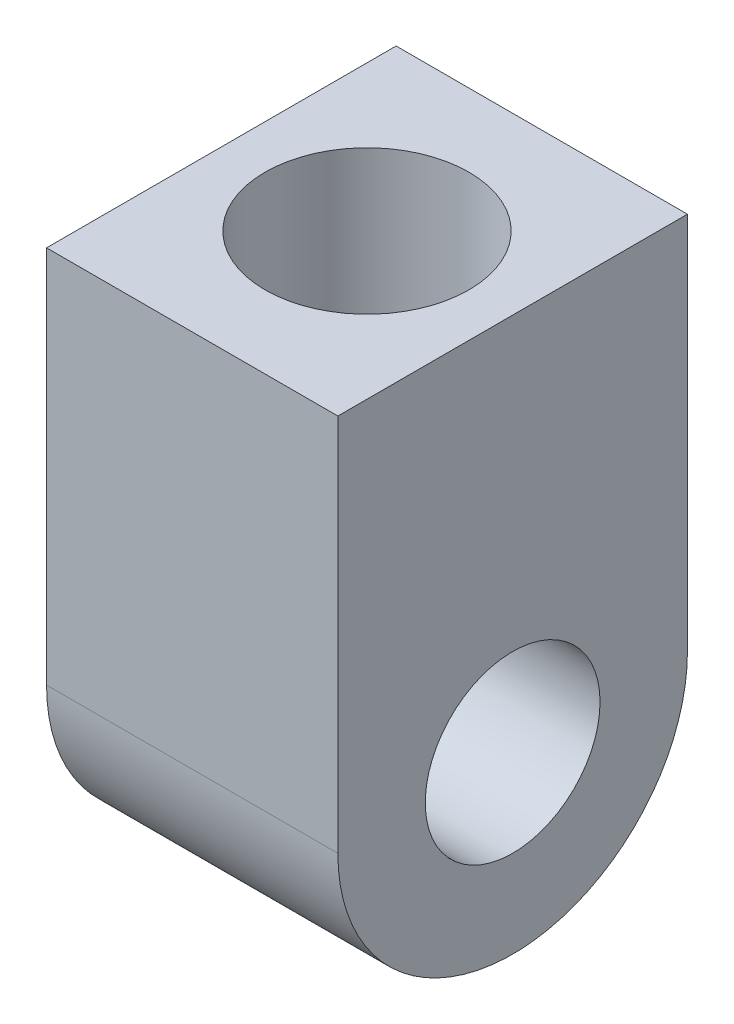
ISO-10303-21;
HEADER;
FILE_DESCRIPTION(('STEP AP214'),'2;1');
FILE_NAME('part.step','',(''),(''),'','','');
FILE_SCHEMA(('AUTOMOTIVE_DESIGN { 1 0 10303 214 1 1 1 1 }'));
ENDSEC;
DATA;
#1=APPLICATION_CONTEXT('core data for automotive mechanical design processes');
#2=APPLICATION_PROTOCOL_DEFINITION('international standard','automotive_design',2000,#1);
#3=PRODUCT_CONTEXT('',#1,'mechanical');
#4=PRODUCT('Part','Part','',(#3));
#5=PRODUCT_RELATED_PRODUCT_CATEGORY('part','',(#4));
#6=PRODUCT_DEFINITION_FORMATION('','',#4);
#7=PRODUCT_DEFINITION_CONTEXT('part definition',#1,'design');
#8=PRODUCT_DEFINITION('design','',#6,#7);
#9=PRODUCT_DEFINITION_SHAPE('','',#8);
#10=(LENGTH_UNIT() NAMED_UNIT(*) SI_UNIT(.MILLI.,.METRE.));
#11=(NAMED_UNIT(*) PLANE_ANGLE_UNIT() SI_UNIT($,.RADIAN.));
#12=(NAMED_UNIT(*) SI_UNIT($,.STERADIAN.) SOLID_ANGLE_UNIT());
#13=UNCERTAINTY_MEASURE_WITH_UNIT(LENGTH_MEASURE(1.E-05),#10,'distance_accuracy_value','');
#14=(GEOMETRIC_REPRESENTATION_CONTEXT(3) GLOBAL_UNCERTAINTY_ASSIGNED_CONTEXT((#13)) GLOBAL_UNIT_ASSIGNED_CONTEXT((#10,
#11,#12)) REPRESENTATION_CONTEXT('',''));
#15=CARTESIAN_POINT('',(0.,0.,0.));
#16=DIRECTION('',(0.,0.,1.));
#17=DIRECTION('',(1.,0.,0.));
#18=AXIS2_PLACEMENT_3D('',#15,#16,#17);
#19=CARTESIAN_POINT('',(10.,0.,0.));
#20=DIRECTION('',(-1.,0.,0.));
#21=DIRECTION('',(0.,0.,1.));
#22=AXIS2_PLACEMENT_3D('',#19,#20,#21);
#23=CYLINDRICAL_SURFACE('',#22,6.);
#24=DIRECTION('',(-1.,0.,0.));
#25=VECTOR('',#24,1.);
#26=CARTESIAN_POINT('',(10.,0.,-6.));
#27=LINE('',#26,#25);
#28=CARTESIAN_POINT('',(10.,0.,-6.));
#29=VERTEX_POINT('',#28);
#30=CARTESIAN_POINT('',(0.,0.,-6.));
#31=VERTEX_POINT('',#30);
#32=EDGE_CURVE('E101',#29,#31,#27,.T.);
#33=ORIENTED_EDGE('',*,*,#32,.F.);
#34=CARTESIAN_POINT('',(10.,0.,0.));
#35=DIRECTION('',(1.,0.,0.));
#36=DIRECTION('',(0.,0.,-1.));
#37=AXIS2_PLACEMENT_3D('',#34,#35,#36);
#38=CIRCLE('',#37,6.);
#39=CARTESIAN_POINT('',(10.,0.,6.));
#40=VERTEX_POINT('',#39);
#41=EDGE_CURVE('E11',#40,#29,#38,.T.);
#42=ORIENTED_EDGE('',*,*,#41,.F.);
#43=DIRECTION('',(1.,0.,0.));
#44=VECTOR('',#43,1.);
#45=CARTESIAN_POINT('',(10.,0.,6.));
#46=LINE('',#45,#44);
#47=CARTESIAN_POINT('',(0.,0.,6.));
#48=VERTEX_POINT('',#47);
#49=EDGE_CURVE('E103',#48,#40,#46,.T.);
#50=ORIENTED_EDGE('',*,*,#49,.F.);
#51=CARTESIAN_POINT('',(0.,0.,0.));
#52=DIRECTION('',(1.,0.,0.));
#53=DIRECTION('',(0.,0.,-1.));
#54=AXIS2_PLACEMENT_3D('',#51,#52,#53);
#55=CIRCLE('',#54,6.);
#56=EDGE_CURVE('E38',#48,#31,#55,.T.);
#57=ORIENTED_EDGE('',*,*,#56,.T.);
#58=EDGE_LOOP('',(#33,#42,#50,#57));
#59=FACE_BOUND('',#58,.T.);
#60=ADVANCED_FACE('F35',(#59),#23,.T.);
#61=CARTESIAN_POINT('',(10.,0.,0.));
#62=DIRECTION('',(1.,0.,0.));
#63=DIRECTION('',(0.,0.,-1.));
#64=AXIS2_PLACEMENT_3D('',#61,#62,#63);
#65=PLANE('',#64);
#66=CARTESIAN_POINT('',(10.,0.,0.));
#67=DIRECTION('',(1.,0.,0.));
#68=DIRECTION('',(0.,0.,-1.));
#69=AXIS2_PLACEMENT_3D('',#66,#67,#68);
#70=CIRCLE('',#69,3.);
#71=CARTESIAN_POINT('',(10.,0.,-3.));
#72=VERTEX_POINT('',#71);
#73=EDGE_CURVE('E110',#72,#72,#70,.T.);
#74=ORIENTED_EDGE('',*,*,#73,.F.);
#75=EDGE_LOOP('',(#74));
#76=FACE_BOUND('',#75,.T.);
#77=DIRECTION('',(0.,-1.,0.));
#78=VECTOR('',#77,1.);
#79=CARTESIAN_POINT('',(10.,13.,6.));
#80=LINE('',#79,#78);
#81=CARTESIAN_POINT('',(10.,13.,6.));
#82=VERTEX_POINT('',#81);
#83=EDGE_CURVE('E48',#82,#40,#80,.T.);
#84=ORIENTED_EDGE('',*,*,#83,.T.);
#85=ORIENTED_EDGE('',*,*,#41,.T.);
#86=DIRECTION('',(0.,-1.,0.));
#87=VECTOR('',#86,1.);
#88=CARTESIAN_POINT('',(10.,13.,-6.));
#89=LINE('',#88,#87);
#90=CARTESIAN_POINT('',(10.,13.,-6.));
#91=VERTEX_POINT('',#90);
#92=EDGE_CURVE('E73',#91,#29,#89,.T.);
#93=ORIENTED_EDGE('',*,*,#92,.F.);
#94=DIRECTION('',(0.,0.,-1.));
#95=VECTOR('',#94,1.);
#96=CARTESIAN_POINT('',(10.,13.,6.));
#97=LINE('',#96,#95);
#98=EDGE_CURVE('E56',#82,#91,#97,.T.);
#99=ORIENTED_EDGE('',*,*,#98,.F.);
#100=EDGE_LOOP('',(#84,#85,#93,#99));
#101=FACE_BOUND('',#100,.T.);
#102=ADVANCED_FACE('F129',(#76,#101),#65,.T.);
#103=CARTESIAN_POINT('',(0.,0.,0.));
#104=DIRECTION('',(1.,0.,0.));
#105=DIRECTION('',(0.,0.,-1.));
#106=AXIS2_PLACEMENT_3D('',#103,#104,#105);
#107=PLANE('',#106);
#108=CARTESIAN_POINT('',(0.,0.,0.));
#109=DIRECTION('',(1.,0.,0.));
#110=DIRECTION('',(0.,0.,-1.));
#111=AXIS2_PLACEMENT_3D('',#108,#109,#110);
#112=CIRCLE('',#111,3.);
#113=CARTESIAN_POINT('',(0.,0.,-3.));
#114=VERTEX_POINT('',#113);
#115=EDGE_CURVE('E109',#114,#114,#112,.T.);
#116=ORIENTED_EDGE('',*,*,#115,.T.);
#117=EDGE_LOOP('',(#116));
#118=FACE_BOUND('',#117,.T.);
#119=ORIENTED_EDGE('',*,*,#56,.F.);
#120=DIRECTION('',(0.,-1.,0.));
#121=VECTOR('',#120,1.);
#122=CARTESIAN_POINT('',(0.,13.,6.));
#123=LINE('',#122,#121);
#124=CARTESIAN_POINT('',(0.,13.,6.));
#125=VERTEX_POINT('',#124);
#126=EDGE_CURVE('E89',#125,#48,#123,.T.);
#127=ORIENTED_EDGE('',*,*,#126,.F.);
#128=DIRECTION('',(0.,0.,1.));
#129=VECTOR('',#128,1.);
#130=CARTESIAN_POINT('',(0.,13.,6.));
#131=LINE('',#130,#129);
#132=CARTESIAN_POINT('',(0.,13.,-6.));
#133=VERTEX_POINT('',#132);
#134=EDGE_CURVE('E80',#133,#125,#131,.T.);
#135=ORIENTED_EDGE('',*,*,#134,.F.);
#136=DIRECTION('',(0.,-1.,0.));
#137=VECTOR('',#136,1.);
#138=CARTESIAN_POINT('',(0.,13.,-6.));
#139=LINE('',#138,#137);
#140=EDGE_CURVE('E94',#133,#31,#139,.T.);
#141=ORIENTED_EDGE('',*,*,#140,.T.);
#142=EDGE_LOOP('',(#119,#127,#135,#141));
#143=FACE_BOUND('',#142,.T.);
#144=ADVANCED_FACE('F90',(#118,#143),#107,.F.);
#145=CARTESIAN_POINT('',(10.,0.,0.));
#146=DIRECTION('',(-1.,0.,0.));
#147=DIRECTION('',(0.,0.,1.));
#148=AXIS2_PLACEMENT_3D('',#145,#146,#147);
#149=CYLINDRICAL_SURFACE('',#148,3.);
#150=ORIENTED_EDGE('',*,*,#73,.T.);
#151=EDGE_LOOP('',(#150));
#152=FACE_BOUND('',#151,.T.);
#153=ORIENTED_EDGE('',*,*,#115,.F.);
#154=EDGE_LOOP('',(#153));
#155=FACE_BOUND('',#154,.T.);
#156=ADVANCED_FACE('F117',(#152,#155),#149,.F.);
#157=CARTESIAN_POINT('',(5.,13.,0.));
#158=DIRECTION('',(0.,-1.,0.));
#159=DIRECTION('',(0.,0.,-1.));
#160=AXIS2_PLACEMENT_3D('',#157,#158,#159);
#161=CYLINDRICAL_SURFACE('',#160,3.5);
#162=CARTESIAN_POINT('',(5.,13.,0.));
#163=DIRECTION('',(0.,1.,0.));
#164=DIRECTION('',(0.,0.,1.));
#165=AXIS2_PLACEMENT_3D('',#162,#163,#164);
#166=CIRCLE('',#165,3.5);
#167=CARTESIAN_POINT('',(5.,13.,-3.5));
#168=VERTEX_POINT('',#167);
#169=EDGE_CURVE('E104',#168,#168,#166,.T.);
#170=CARTESIAN_POINT('',(5.,4.5,0.));
#171=DIRECTION('',(0.,1.,0.));
#172=DIRECTION('',(0.,0.,1.));
#173=AXIS2_PLACEMENT_3D('',#170,#171,#172);
#174=CIRCLE('',#173,3.5);
#175=CARTESIAN_POINT('',(5.,4.5,-3.5));
#176=VERTEX_POINT('',#175);
#177=EDGE_CURVE('E143',#176,#176,#174,.T.);
#178=CARTESIAN_POINT('',(5.,13.,-3.5));
#179=CARTESIAN_POINT('',(5.,12.9114583333333,-3.5));
#180=CARTESIAN_POINT('',(5.,12.8229166666667,-3.5));
#181=CARTESIAN_POINT('',(5.,12.6458333333333,-3.5));
#182=CARTESIAN_POINT('',(5.,12.5572916666667,-3.5));
#183=CARTESIAN_POINT('',(5.,12.3802083333333,-3.5));
#184=CARTESIAN_POINT('',(5.,12.2916666666667,-3.5));
#185=CARTESIAN_POINT('',(5.,12.1145833333333,-3.5));
#186=CARTESIAN_POINT('',(5.,12.0260416666667,-3.5));
#187=CARTESIAN_POINT('',(5.,11.8489583333333,-3.5));
#188=CARTESIAN_POINT('',(5.,11.7604166666667,-3.5));
#189=CARTESIAN_POINT('',(5.,11.5833333333333,-3.5));
#190=CARTESIAN_POINT('',(5.,11.4947916666667,-3.5));
#191=CARTESIAN_POINT('',(5.,11.3177083333333,-3.5));
#192=CARTESIAN_POINT('',(5.,11.2291666666667,-3.5));
#193=CARTESIAN_POINT('',(5.,11.0520833333333,-3.5));
#194=CARTESIAN_POINT('',(5.,10.9635416666667,-3.5));
#195=CARTESIAN_POINT('',(5.,10.7864583333333,-3.5));
#196=CARTESIAN_POINT('',(5.,10.6979166666667,-3.5));
#197=CARTESIAN_POINT('',(5.,10.5208333333333,-3.5));
#198=CARTESIAN_POINT('',(5.,10.4322916666667,-3.5));
#199=CARTESIAN_POINT('',(5.,10.2552083333333,-3.5));
#200=CARTESIAN_POINT('',(5.,10.1666666666667,-3.5));
#201=CARTESIAN_POINT('',(5.,9.98958333333333,-3.5));
#202=CARTESIAN_POINT('',(5.,9.90104166666667,-3.5));
#203=CARTESIAN_POINT('',(5.,9.72395833333333,-3.5));
#204=CARTESIAN_POINT('',(5.,9.63541666666667,-3.5));
#205=CARTESIAN_POINT('',(5.,9.45833333333333,-3.5));
#206=CARTESIAN_POINT('',(5.,9.36979166666666,-3.5));
#207=CARTESIAN_POINT('',(5.,9.19270833333333,-3.5));
#208=CARTESIAN_POINT('',(5.,9.10416666666666,-3.5));
#209=CARTESIAN_POINT('',(5.,8.92708333333333,-3.5));
#210=CARTESIAN_POINT('',(5.,8.83854166666666,-3.5));
#211=CARTESIAN_POINT('',(5.,8.66145833333333,-3.5));
#212=CARTESIAN_POINT('',(5.,8.57291666666666,-3.5));
#213=CARTESIAN_POINT('',(5.,8.39583333333333,-3.5));
#214=CARTESIAN_POINT('',(5.,8.30729166666666,-3.5));
#215=CARTESIAN_POINT('',(5.,8.13020833333333,-3.5));
#216=CARTESIAN_POINT('',(5.,8.04166666666666,-3.5));
#217=CARTESIAN_POINT('',(5.,7.86458333333333,-3.5));
#218=CARTESIAN_POINT('',(5.,7.77604166666666,-3.5));
#219=CARTESIAN_POINT('',(5.,7.59895833333333,-3.5));
#220=CARTESIAN_POINT('',(5.,7.51041666666666,-3.5));
#221=CARTESIAN_POINT('',(5.,7.33333333333333,-3.5));
#222=CARTESIAN_POINT('',(5.,7.24479166666666,-3.5));
#223=CARTESIAN_POINT('',(5.,7.06770833333333,-3.5));
#224=CARTESIAN_POINT('',(5.,6.97916666666666,-3.5));
#225=CARTESIAN_POINT('',(5.,6.80208333333333,-3.5));
#226=CARTESIAN_POINT('',(5.,6.71354166666666,-3.5));
#227=CARTESIAN_POINT('',(5.,6.53645833333333,-3.5));
#228=CARTESIAN_POINT('',(5.,6.44791666666666,-3.5));
#229=CARTESIAN_POINT('',(5.,6.27083333333333,-3.5));
#230=CARTESIAN_POINT('',(5.,6.18229166666666,-3.5));
#231=CARTESIAN_POINT('',(5.,6.00520833333333,-3.5));
#232=CARTESIAN_POINT('',(5.,5.91666666666666,-3.5));
#233=CARTESIAN_POINT('',(5.,5.73958333333333,-3.5));
#234=CARTESIAN_POINT('',(5.,5.65104166666666,-3.5));
#235=CARTESIAN_POINT('',(5.,5.47395833333333,-3.5));
#236=CARTESIAN_POINT('',(5.,5.38541666666666,-3.5));
#237=CARTESIAN_POINT('',(5.,5.20833333333333,-3.5));
#238=CARTESIAN_POINT('',(5.,5.11979166666666,-3.5));
#239=CARTESIAN_POINT('',(5.,4.94270833333333,-3.5));
#240=CARTESIAN_POINT('',(5.,4.85416666666666,-3.5));
#241=CARTESIAN_POINT('',(5.,4.67708333333333,-3.5));
#242=CARTESIAN_POINT('',(5.,4.58854166666666,-3.5));
#243=CARTESIAN_POINT('',(5.,4.5,-3.5));
#244=B_SPLINE_CURVE_WITH_KNOTS('',3,(#178,#179,#180,#181,#182,#183,#184,#185,#186,#187,#188,
#189,#190,#191,#192,#193,#194,#195,#196,#197,#198,#199,#200,#201,#202,#203,#204,#205,#206,#207,
#208,#209,#210,#211,#212,#213,#214,#215,#216,#217,#218,#219,#220,#221,#222,#223,#224,#225,#226,
#227,#228,#229,#230,#231,#232,#233,#234,#235,#236,#237,#238,#239,#240,#241,#242,#243),
.UNSPECIFIED.,.F.,.F.,(4,2,2,2,2,2,2,2,2,2,2,2,2,2,2,2,2,2,2,2,2,2,2,2,2,2,2,2,2,2,2,2,4),(0.,
0.265624999999999,0.531249999999999,0.796874999999999,1.0625,1.328125,1.59375,1.859375,2.125,
2.390625,2.65625,2.921875,3.1875,3.453125,3.71875,3.984375,4.25,4.515625,4.78125,5.046875,
5.3125,5.578125,5.84375,6.109375,6.375,6.640625,6.90625,7.171875,7.4375,7.703125,7.96875,
8.234375,8.5),.UNSPECIFIED.);
#245=EDGE_CURVE('BSEAM119',#168,#176,#244,.T.);
#246=ORIENTED_EDGE('',*,*,#169,.T.);
#247=ORIENTED_EDGE('',*,*,#177,.F.);
#248=ORIENTED_EDGE('',*,*,#245,.T.);
#249=ORIENTED_EDGE('',*,*,#245,.F.);
#250=EDGE_LOOP('',(#246,#248,#247,#249));
#251=FACE_BOUND('',#250,.T.);
#252=ADVANCED_FACE('F119',(#251),#161,.F.);
#253=CARTESIAN_POINT('',(0.,13.,0.));
#254=DIRECTION('',(0.,-1.,0.));
#255=DIRECTION('',(0.,0.,-1.));
#256=AXIS2_PLACEMENT_3D('',#253,#254,#255);
#257=PLANE('',#256);
#258=DIRECTION('',(-1.,0.,0.));
#259=VECTOR('',#258,1.);
#260=CARTESIAN_POINT('',(10.,13.,-6.));
#261=LINE('',#260,#259);
#262=EDGE_CURVE('E85',#91,#133,#261,.T.);
#263=ORIENTED_EDGE('',*,*,#262,.T.);
#264=ORIENTED_EDGE('',*,*,#134,.T.);
#265=DIRECTION('',(1.,0.,0.));
#266=VECTOR('',#265,1.);
#267=CARTESIAN_POINT('',(10.,13.,6.));
#268=LINE('',#267,#266);
#269=EDGE_CURVE('E84',#125,#82,#268,.T.);
#270=ORIENTED_EDGE('',*,*,#269,.T.);
#271=ORIENTED_EDGE('',*,*,#98,.T.);
#272=EDGE_LOOP('',(#263,#264,#270,#271));
#273=FACE_BOUND('',#272,.T.);
#274=ORIENTED_EDGE('',*,*,#169,.F.);
#275=EDGE_LOOP('',(#274));
#276=FACE_BOUND('',#275,.T.);
#277=ADVANCED_FACE('F81',(#273,#276),#257,.F.);
#278=CARTESIAN_POINT('',(10.,13.,-6.));
#279=DIRECTION('',(0.,0.,1.));
#280=DIRECTION('',(1.,0.,0.));
#281=AXIS2_PLACEMENT_3D('',#278,#279,#280);
#282=PLANE('',#281);
#283=ORIENTED_EDGE('',*,*,#32,.T.);
#284=ORIENTED_EDGE('',*,*,#140,.F.);
#285=ORIENTED_EDGE('',*,*,#262,.F.);
#286=ORIENTED_EDGE('',*,*,#92,.T.);
#287=EDGE_LOOP('',(#283,#284,#285,#286));
#288=FACE_BOUND('',#287,.T.);
#289=ADVANCED_FACE('F139',(#288),#282,.F.);
#290=CARTESIAN_POINT('',(10.,13.,6.));
#291=DIRECTION('',(0.,0.,-1.));
#292=DIRECTION('',(-1.,0.,0.));
#293=AXIS2_PLACEMENT_3D('',#290,#291,#292);
#294=PLANE('',#293);
#295=ORIENTED_EDGE('',*,*,#49,.T.);
#296=ORIENTED_EDGE('',*,*,#83,.F.);
#297=ORIENTED_EDGE('',*,*,#269,.F.);
#298=ORIENTED_EDGE('',*,*,#126,.T.);
#299=EDGE_LOOP('',(#295,#296,#297,#298));
#300=FACE_BOUND('',#299,.T.);
#301=ADVANCED_FACE('F96',(#300),#294,.F.);
#302=CARTESIAN_POINT('',(5.,4.5,0.));
#303=DIRECTION('',(0.,1.,0.));
#304=DIRECTION('',(0.,0.,1.));
#305=AXIS2_PLACEMENT_3D('',#302,#303,#304);
#306=PLANE('',#305);
#307=ORIENTED_EDGE('',*,*,#177,.T.);
#308=EDGE_LOOP('',(#307));
#309=FACE_BOUND('',#308,.T.);
#310=ADVANCED_FACE('F147',(#309),#306,.T.);
#311=CLOSED_SHELL('',(#60,#102,#144,#156,#252,#277,#289,#301,#310));
#312=MANIFOLD_SOLID_BREP('B2',#311);
#313=ADVANCED_BREP_SHAPE_REPRESENTATION('',(#18,#312),#14);
#314=SHAPE_DEFINITION_REPRESENTATION(#9,#313);
ENDSEC;
END-ISO-10303-21;
